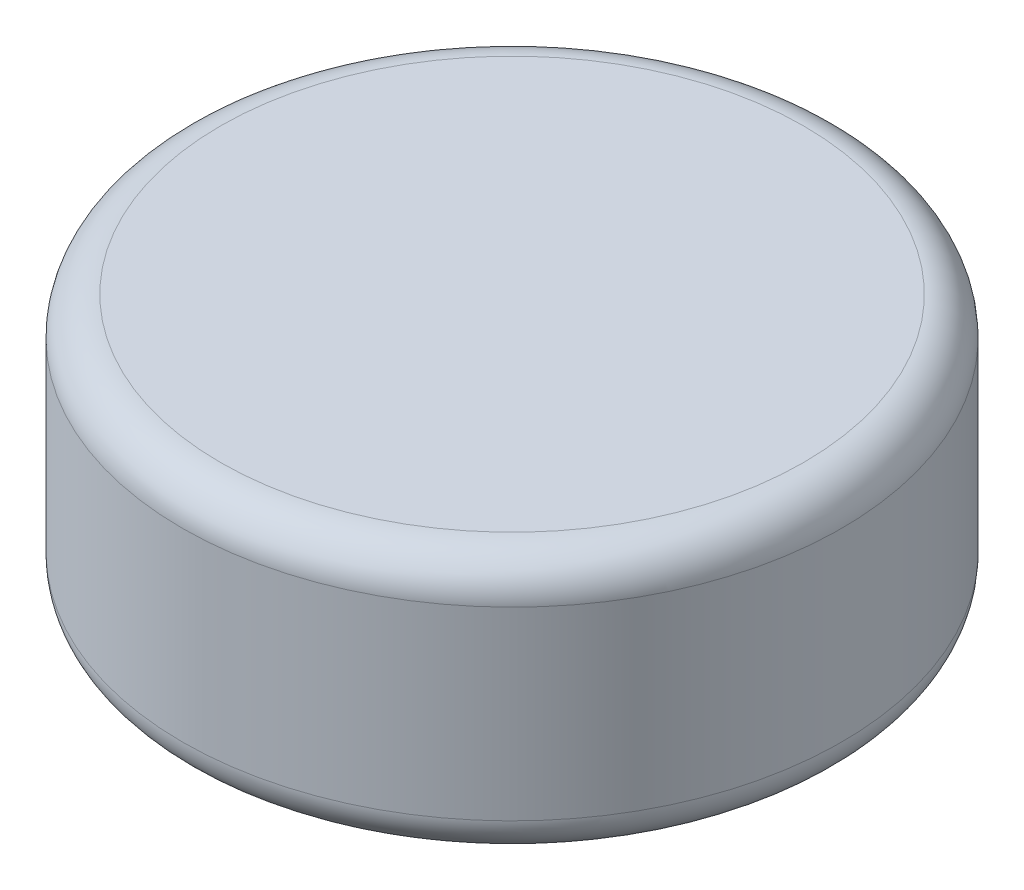
ISO-10303-21;
HEADER;
FILE_DESCRIPTION(('STEP AP214'),'2;1');
FILE_NAME('part.step','',(''),(''),'','','');
FILE_SCHEMA(('AUTOMOTIVE_DESIGN { 1 0 10303 214 1 1 1 1 }'));
ENDSEC;
DATA;
#1=APPLICATION_CONTEXT('core data for automotive mechanical design processes');
#2=APPLICATION_PROTOCOL_DEFINITION('international standard','automotive_design',2000,#1);
#3=PRODUCT_CONTEXT('',#1,'mechanical');
#4=PRODUCT('Part','Part','',(#3));
#5=PRODUCT_RELATED_PRODUCT_CATEGORY('part','',(#4));
#6=PRODUCT_DEFINITION_FORMATION('','',#4);
#7=PRODUCT_DEFINITION_CONTEXT('part definition',#1,'design');
#8=PRODUCT_DEFINITION('design','',#6,#7);
#9=PRODUCT_DEFINITION_SHAPE('','',#8);
#10=(LENGTH_UNIT() NAMED_UNIT(*) SI_UNIT(.MILLI.,.METRE.));
#11=(NAMED_UNIT(*) PLANE_ANGLE_UNIT() SI_UNIT($,.RADIAN.));
#12=(NAMED_UNIT(*) SI_UNIT($,.STERADIAN.) SOLID_ANGLE_UNIT());
#13=UNCERTAINTY_MEASURE_WITH_UNIT(LENGTH_MEASURE(1.E-05),#10,'distance_accuracy_value','');
#14=(GEOMETRIC_REPRESENTATION_CONTEXT(3) GLOBAL_UNCERTAINTY_ASSIGNED_CONTEXT((#13)) GLOBAL_UNIT_ASSIGNED_CONTEXT((#10,
#11,#12)) REPRESENTATION_CONTEXT('',''));
#15=CARTESIAN_POINT('',(0.,0.,0.));
#16=DIRECTION('',(0.,0.,1.));
#17=DIRECTION('',(1.,0.,0.));
#18=AXIS2_PLACEMENT_3D('',#15,#16,#17);
#19=CARTESIAN_POINT('',(0.,206.,0.));
#20=DIRECTION('',(0.,-1.,0.));
#21=DIRECTION('',(0.,0.,-1.));
#22=AXIS2_PLACEMENT_3D('',#19,#20,#21);
#23=CYLINDRICAL_SURFACE('',#22,260.);
#24=CARTESIAN_POINT('',(0.,176.,0.));
#25=DIRECTION('',(0.,1.,0.));
#26=DIRECTION('',(0.,0.,1.));
#27=AXIS2_PLACEMENT_3D('',#24,#25,#26);
#28=CIRCLE('',#27,260.);
#29=CARTESIAN_POINT('',(0.,176.,260.));
#30=VERTEX_POINT('',#29);
#31=EDGE_CURVE('E37',#30,#30,#28,.F.);
#32=ORIENTED_EDGE('',*,*,#31,.T.);
#33=EDGE_LOOP('',(#32));
#34=FACE_BOUND('',#33,.T.);
#35=CARTESIAN_POINT('',(0.,30.,0.));
#36=DIRECTION('',(0.,1.,0.));
#37=DIRECTION('',(0.,0.,1.));
#38=AXIS2_PLACEMENT_3D('',#35,#36,#37);
#39=CIRCLE('',#38,260.);
#40=CARTESIAN_POINT('',(0.,30.,260.));
#41=VERTEX_POINT('',#40);
#42=EDGE_CURVE('E41',#41,#41,#39,.T.);
#43=ORIENTED_EDGE('',*,*,#42,.T.);
#44=EDGE_LOOP('',(#43));
#45=FACE_BOUND('',#44,.T.);
#46=ADVANCED_FACE('F30',(#34,#45),#23,.T.);
#47=CARTESIAN_POINT('',(0.,206.,0.));
#48=DIRECTION('',(0.,1.,0.));
#49=DIRECTION('',(0.,0.,1.));
#50=AXIS2_PLACEMENT_3D('',#47,#48,#49);
#51=PLANE('',#50);
#52=CARTESIAN_POINT('',(0.,206.,0.));
#53=DIRECTION('',(0.,1.,0.));
#54=DIRECTION('',(0.,0.,1.));
#55=AXIS2_PLACEMENT_3D('',#52,#53,#54);
#56=CIRCLE('',#55,230.);
#57=CARTESIAN_POINT('',(0.,206.,230.));
#58=VERTEX_POINT('',#57);
#59=EDGE_CURVE('E45',#58,#58,#56,.T.);
#60=ORIENTED_EDGE('',*,*,#59,.T.);
#61=EDGE_LOOP('',(#60));
#62=FACE_BOUND('',#61,.T.);
#63=ADVANCED_FACE('F51',(#62),#51,.T.);
#64=CARTESIAN_POINT('',(0.,0.,0.));
#65=DIRECTION('',(0.,1.,0.));
#66=DIRECTION('',(0.,0.,1.));
#67=AXIS2_PLACEMENT_3D('',#64,#65,#66);
#68=PLANE('',#67);
#69=CARTESIAN_POINT('',(0.,0.,0.));
#70=DIRECTION('',(0.,1.,0.));
#71=DIRECTION('',(0.,0.,1.));
#72=AXIS2_PLACEMENT_3D('',#69,#70,#71);
#73=CIRCLE('',#72,230.);
#74=CARTESIAN_POINT('',(0.,0.,230.));
#75=VERTEX_POINT('',#74);
#76=EDGE_CURVE('E10',#75,#75,#73,.F.);
#77=ORIENTED_EDGE('',*,*,#76,.T.);
#78=EDGE_LOOP('',(#77));
#79=FACE_BOUND('',#78,.T.);
#80=ADVANCED_FACE('F55',(#79),#68,.F.);
#81=CARTESIAN_POINT('',(0.,176.,0.));
#82=DIRECTION('',(0.,1.,0.));
#83=DIRECTION('',(0.,0.,1.));
#84=AXIS2_PLACEMENT_3D('',#81,#82,#83);
#85=TOROIDAL_SURFACE('',#84,230.,30.);
#86=ORIENTED_EDGE('',*,*,#31,.F.);
#87=EDGE_LOOP('',(#86));
#88=FACE_BOUND('',#87,.T.);
#89=ORIENTED_EDGE('',*,*,#59,.F.);
#90=EDGE_LOOP('',(#89));
#91=FACE_BOUND('',#90,.T.);
#92=ADVANCED_FACE('F53',(#88,#91),#85,.T.);
#93=CARTESIAN_POINT('',(0.,30.,0.));
#94=DIRECTION('',(0.,1.,0.));
#95=DIRECTION('',(0.,0.,1.));
#96=AXIS2_PLACEMENT_3D('',#93,#94,#95);
#97=TOROIDAL_SURFACE('',#96,230.,30.);
#98=ORIENTED_EDGE('',*,*,#76,.F.);
#99=EDGE_LOOP('',(#98));
#100=FACE_BOUND('',#99,.T.);
#101=ORIENTED_EDGE('',*,*,#42,.F.);
#102=EDGE_LOOP('',(#101));
#103=FACE_BOUND('',#102,.T.);
#104=ADVANCED_FACE('F32',(#100,#103),#97,.T.);
#105=CLOSED_SHELL('',(#46,#63,#80,#92,#104));
#106=MANIFOLD_SOLID_BREP('B2',#105);
#107=ADVANCED_BREP_SHAPE_REPRESENTATION('',(#18,#106),#14);
#108=SHAPE_DEFINITION_REPRESENTATION(#9,#107);
ENDSEC;
END-ISO-10303-21;
